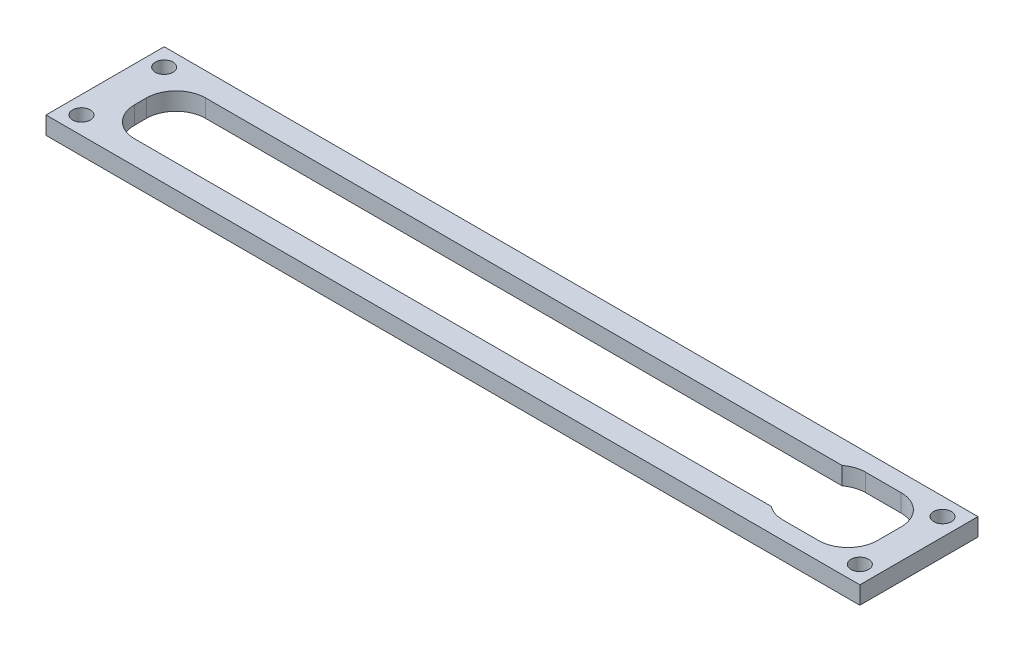
ISO-10303-21;
HEADER;
FILE_DESCRIPTION(('STEP AP214'),'2;1');
FILE_NAME('part.step','',(''),(''),'','','');
FILE_SCHEMA(('AUTOMOTIVE_DESIGN { 1 0 10303 214 1 1 1 1 }'));
ENDSEC;
DATA;
#1=APPLICATION_CONTEXT('core data for automotive mechanical design processes');
#2=APPLICATION_PROTOCOL_DEFINITION('international standard','automotive_design',2000,#1);
#3=PRODUCT_CONTEXT('',#1,'mechanical');
#4=PRODUCT('Part','Part','',(#3));
#5=PRODUCT_RELATED_PRODUCT_CATEGORY('part','',(#4));
#6=PRODUCT_DEFINITION_FORMATION('','',#4);
#7=PRODUCT_DEFINITION_CONTEXT('part definition',#1,'design');
#8=PRODUCT_DEFINITION('design','',#6,#7);
#9=PRODUCT_DEFINITION_SHAPE('','',#8);
#10=(LENGTH_UNIT() NAMED_UNIT(*) SI_UNIT(.MILLI.,.METRE.));
#11=(NAMED_UNIT(*) PLANE_ANGLE_UNIT() SI_UNIT($,.RADIAN.));
#12=(NAMED_UNIT(*) SI_UNIT($,.STERADIAN.) SOLID_ANGLE_UNIT());
#13=UNCERTAINTY_MEASURE_WITH_UNIT(LENGTH_MEASURE(1.E-05),#10,'distance_accuracy_value','');
#14=(GEOMETRIC_REPRESENTATION_CONTEXT(3) GLOBAL_UNCERTAINTY_ASSIGNED_CONTEXT((#13)) GLOBAL_UNIT_ASSIGNED_CONTEXT((#10,
#11,#12)) REPRESENTATION_CONTEXT('',''));
#15=CARTESIAN_POINT('',(0.,0.,0.));
#16=DIRECTION('',(0.,0.,1.));
#17=DIRECTION('',(1.,0.,0.));
#18=AXIS2_PLACEMENT_3D('',#15,#16,#17);
#19=CARTESIAN_POINT('',(0.,3.,0.));
#20=DIRECTION('',(0.,-1.,0.));
#21=DIRECTION('',(0.,0.,-1.));
#22=AXIS2_PLACEMENT_3D('',#19,#20,#21);
#23=PLANE('',#22);
#24=DIRECTION('',(0.,0.,1.));
#25=VECTOR('',#24,1.);
#26=CARTESIAN_POINT('',(0.,3.,0.));
#27=LINE('',#26,#25);
#28=CARTESIAN_POINT('',(0.,3.,-20.));
#29=VERTEX_POINT('',#28);
#30=CARTESIAN_POINT('',(0.,3.,0.));
#31=VERTEX_POINT('',#30);
#32=EDGE_CURVE('E250',#29,#31,#27,.T.);
#33=ORIENTED_EDGE('',*,*,#32,.T.);
#34=DIRECTION('',(1.,0.,0.));
#35=VECTOR('',#34,1.);
#36=CARTESIAN_POINT('',(0.,3.,0.));
#37=LINE('',#36,#35);
#38=CARTESIAN_POINT('',(137.727780531203,3.,0.));
#39=VERTEX_POINT('',#38);
#40=EDGE_CURVE('E253',#31,#39,#37,.T.);
#41=ORIENTED_EDGE('',*,*,#40,.T.);
#42=DIRECTION('',(0.,0.,-1.));
#43=VECTOR('',#42,1.);
#44=CARTESIAN_POINT('',(137.727780531203,3.,0.));
#45=LINE('',#44,#43);
#46=CARTESIAN_POINT('',(137.727780531203,3.,-20.));
#47=VERTEX_POINT('',#46);
#48=EDGE_CURVE('E256',#39,#47,#45,.T.);
#49=ORIENTED_EDGE('',*,*,#48,.T.);
#50=DIRECTION('',(-1.,0.,0.));
#51=VECTOR('',#50,1.);
#52=CARTESIAN_POINT('',(0.,3.,-20.));
#53=LINE('',#52,#51);
#54=EDGE_CURVE('E258',#47,#29,#53,.T.);
#55=ORIENTED_EDGE('',*,*,#54,.T.);
#56=EDGE_LOOP('',(#33,#41,#49,#55));
#57=FACE_BOUND('',#56,.T.);
#58=DIRECTION('',(-1.,0.,0.));
#59=VECTOR('',#58,1.);
#60=CARTESIAN_POINT('',(5.99999999999999,3.,-16.));
#61=LINE('',#60,#59);
#62=CARTESIAN_POINT('',(118.727780531203,3.,-16.));
#63=VERTEX_POINT('',#62);
#64=CARTESIAN_POINT('',(11.,3.,-16.));
#65=VERTEX_POINT('',#64);
#66=EDGE_CURVE('E243',#63,#65,#61,.T.);
#67=ORIENTED_EDGE('',*,*,#66,.F.);
#68=CARTESIAN_POINT('',(121.727780531203,3.,-12.));
#69=DIRECTION('',(0.,-1.,0.));
#70=DIRECTION('',(0.,0.,-1.));
#71=AXIS2_PLACEMENT_3D('',#68,#69,#70);
#72=CIRCLE('',#71,5.);
#73=CARTESIAN_POINT('',(121.727780531203,3.,-17.));
#74=VERTEX_POINT('',#73);
#75=EDGE_CURVE('E193',#63,#74,#72,.T.);
#76=ORIENTED_EDGE('',*,*,#75,.T.);
#77=DIRECTION('',(-1.,0.,0.));
#78=VECTOR('',#77,1.);
#79=CARTESIAN_POINT('',(118.727780531203,3.,-17.));
#80=LINE('',#79,#78);
#81=CARTESIAN_POINT('',(127.727780531203,3.,-17.));
#82=VERTEX_POINT('',#81);
#83=EDGE_CURVE('E205',#82,#74,#80,.T.);
#84=ORIENTED_EDGE('',*,*,#83,.F.);
#85=CARTESIAN_POINT('',(127.727780531203,3.,-12.));
#86=DIRECTION('',(0.,-1.,0.));
#87=DIRECTION('',(0.,0.,-1.));
#88=AXIS2_PLACEMENT_3D('',#85,#86,#87);
#89=CIRCLE('',#88,5.);
#90=CARTESIAN_POINT('',(132.727780531203,3.,-12.));
#91=VERTEX_POINT('',#90);
#92=EDGE_CURVE('E185',#82,#91,#89,.T.);
#93=ORIENTED_EDGE('',*,*,#92,.T.);
#94=DIRECTION('',(0.,0.,-1.));
#95=VECTOR('',#94,1.);
#96=CARTESIAN_POINT('',(132.727780531203,3.,-17.));
#97=LINE('',#96,#95);
#98=CARTESIAN_POINT('',(132.727780531203,3.,-8.00000000000002));
#99=VERTEX_POINT('',#98);
#100=EDGE_CURVE('E202',#99,#91,#97,.T.);
#101=ORIENTED_EDGE('',*,*,#100,.F.);
#102=CARTESIAN_POINT('',(127.727780531203,3.,-8.00000000000002));
#103=DIRECTION('',(0.,-1.,0.));
#104=DIRECTION('',(0.,0.,-1.));
#105=AXIS2_PLACEMENT_3D('',#102,#103,#104);
#106=CIRCLE('',#105,5.);
#107=CARTESIAN_POINT('',(127.727780531203,3.,-3.00000000000002));
#108=VERTEX_POINT('',#107);
#109=EDGE_CURVE('E189',#99,#108,#106,.T.);
#110=ORIENTED_EDGE('',*,*,#109,.T.);
#111=DIRECTION('',(1.,0.,0.));
#112=VECTOR('',#111,1.);
#113=CARTESIAN_POINT('',(118.727780531203,3.,-3.00000000000002));
#114=LINE('',#113,#112);
#115=CARTESIAN_POINT('',(121.727780531203,3.,-3.00000000000002));
#116=VERTEX_POINT('',#115);
#117=EDGE_CURVE('E200',#116,#108,#114,.T.);
#118=ORIENTED_EDGE('',*,*,#117,.F.);
#119=CARTESIAN_POINT('',(121.727780531203,3.,-8.00000000000002));
#120=DIRECTION('',(0.,-1.,0.));
#121=DIRECTION('',(0.,0.,-1.));
#122=AXIS2_PLACEMENT_3D('',#119,#120,#121);
#123=CIRCLE('',#122,5.);
#124=CARTESIAN_POINT('',(118.727780531203,3.,-4.00000000000002));
#125=VERTEX_POINT('',#124);
#126=EDGE_CURVE('E43',#116,#125,#123,.T.);
#127=ORIENTED_EDGE('',*,*,#126,.T.);
#128=DIRECTION('',(1.,0.,0.));
#129=VECTOR('',#128,1.);
#130=CARTESIAN_POINT('',(5.99999999999999,3.,-4.00000000000002));
#131=LINE('',#130,#129);
#132=CARTESIAN_POINT('',(11.,3.,-4.00000000000002));
#133=VERTEX_POINT('',#132);
#134=EDGE_CURVE('E162',#133,#125,#131,.T.);
#135=ORIENTED_EDGE('',*,*,#134,.F.);
#136=CARTESIAN_POINT('',(11.,3.,-9.00000000000001));
#137=DIRECTION('',(0.,-1.,0.));
#138=DIRECTION('',(0.,0.,-1.));
#139=AXIS2_PLACEMENT_3D('',#136,#137,#138);
#140=CIRCLE('',#139,5.);
#141=CARTESIAN_POINT('',(5.99999999999999,3.,-9.00000000000001));
#142=VERTEX_POINT('',#141);
#143=EDGE_CURVE('E179',#133,#142,#140,.T.);
#144=ORIENTED_EDGE('',*,*,#143,.T.);
#145=DIRECTION('',(0.,0.,1.));
#146=VECTOR('',#145,1.);
#147=CARTESIAN_POINT('',(5.99999999999999,3.,-16.));
#148=LINE('',#147,#146);
#149=CARTESIAN_POINT('',(5.99999999999999,3.,-11.));
#150=VERTEX_POINT('',#149);
#151=EDGE_CURVE('E239',#150,#142,#148,.T.);
#152=ORIENTED_EDGE('',*,*,#151,.F.);
#153=CARTESIAN_POINT('',(11.,3.,-11.));
#154=DIRECTION('',(0.,-1.,0.));
#155=DIRECTION('',(0.,0.,-1.));
#156=AXIS2_PLACEMENT_3D('',#153,#154,#155);
#157=CIRCLE('',#156,5.);
#158=EDGE_CURVE('E183',#150,#65,#157,.T.);
#159=ORIENTED_EDGE('',*,*,#158,.T.);
#160=EDGE_LOOP('',(#67,#76,#84,#93,#101,#110,#118,#127,#135,#144,#152,#159));
#161=FACE_BOUND('',#160,.T.);
#162=CARTESIAN_POINT('',(3.,3.,-17.));
#163=DIRECTION('',(0.,1.,0.));
#164=DIRECTION('',(0.,0.,1.));
#165=AXIS2_PLACEMENT_3D('',#162,#163,#164);
#166=CIRCLE('',#165,1.5);
#167=CARTESIAN_POINT('',(3.,3.,-15.5));
#168=VERTEX_POINT('',#167);
#169=EDGE_CURVE('E234',#168,#168,#166,.T.);
#170=ORIENTED_EDGE('',*,*,#169,.F.);
#171=EDGE_LOOP('',(#170));
#172=FACE_BOUND('',#171,.T.);
#173=CARTESIAN_POINT('',(3.,3.,-3.));
#174=DIRECTION('',(0.,1.,0.));
#175=DIRECTION('',(0.,0.,-1.));
#176=AXIS2_PLACEMENT_3D('',#173,#174,#175);
#177=CIRCLE('',#176,1.5);
#178=CARTESIAN_POINT('',(3.,3.,-4.5));
#179=VERTEX_POINT('',#178);
#180=EDGE_CURVE('E228',#179,#179,#177,.T.);
#181=ORIENTED_EDGE('',*,*,#180,.F.);
#182=EDGE_LOOP('',(#181));
#183=FACE_BOUND('',#182,.T.);
#184=CARTESIAN_POINT('',(134.727780531203,3.,-3.00000000000002));
#185=DIRECTION('',(0.,1.,0.));
#186=DIRECTION('',(0.,0.,1.));
#187=AXIS2_PLACEMENT_3D('',#184,#185,#186);
#188=CIRCLE('',#187,1.5);
#189=CARTESIAN_POINT('',(134.727780531203,3.,-1.50000000000002));
#190=VERTEX_POINT('',#189);
#191=EDGE_CURVE('E222',#190,#190,#188,.T.);
#192=ORIENTED_EDGE('',*,*,#191,.F.);
#193=EDGE_LOOP('',(#192));
#194=FACE_BOUND('',#193,.T.);
#195=CARTESIAN_POINT('',(134.727780531203,3.,-17.0000000000001));
#196=DIRECTION('',(0.,1.,0.));
#197=DIRECTION('',(0.,0.,-1.));
#198=AXIS2_PLACEMENT_3D('',#195,#196,#197);
#199=CIRCLE('',#198,1.5);
#200=CARTESIAN_POINT('',(134.727780531203,3.,-18.5));
#201=VERTEX_POINT('',#200);
#202=EDGE_CURVE('E216',#201,#201,#199,.T.);
#203=ORIENTED_EDGE('',*,*,#202,.F.);
#204=EDGE_LOOP('',(#203));
#205=FACE_BOUND('',#204,.T.);
#206=ADVANCED_FACE('F35',(#57,#161,#172,#183,#194,#205),#23,.F.);
#207=CARTESIAN_POINT('',(0.,0.,0.));
#208=DIRECTION('',(0.,-1.,0.));
#209=DIRECTION('',(0.,0.,-1.));
#210=AXIS2_PLACEMENT_3D('',#207,#208,#209);
#211=PLANE('',#210);
#212=DIRECTION('',(-1.,0.,0.));
#213=VECTOR('',#212,1.);
#214=CARTESIAN_POINT('',(118.727780531203,0.,-17.));
#215=LINE('',#214,#213);
#216=CARTESIAN_POINT('',(127.727780531203,0.,-17.));
#217=VERTEX_POINT('',#216);
#218=CARTESIAN_POINT('',(121.727780531203,0.,-17.));
#219=VERTEX_POINT('',#218);
#220=EDGE_CURVE('E165',#217,#219,#215,.T.);
#221=ORIENTED_EDGE('',*,*,#220,.T.);
#222=CARTESIAN_POINT('',(121.727780531203,0.,-12.));
#223=DIRECTION('',(0.,-1.,0.));
#224=DIRECTION('',(0.,0.,-1.));
#225=AXIS2_PLACEMENT_3D('',#222,#223,#224);
#226=CIRCLE('',#225,5.);
#227=CARTESIAN_POINT('',(118.727780531203,0.,-16.));
#228=VERTEX_POINT('',#227);
#229=EDGE_CURVE('E195',#219,#228,#226,.F.);
#230=ORIENTED_EDGE('',*,*,#229,.T.);
#231=DIRECTION('',(-1.,0.,0.));
#232=VECTOR('',#231,1.);
#233=CARTESIAN_POINT('',(5.99999999999999,0.,-16.));
#234=LINE('',#233,#232);
#235=CARTESIAN_POINT('',(11.,0.,-16.));
#236=VERTEX_POINT('',#235);
#237=EDGE_CURVE('E154',#228,#236,#234,.T.);
#238=ORIENTED_EDGE('',*,*,#237,.T.);
#239=CARTESIAN_POINT('',(11.,0.,-11.));
#240=DIRECTION('',(0.,-1.,0.));
#241=DIRECTION('',(0.,0.,-1.));
#242=AXIS2_PLACEMENT_3D('',#239,#240,#241);
#243=CIRCLE('',#242,5.);
#244=CARTESIAN_POINT('',(5.99999999999999,0.,-11.));
#245=VERTEX_POINT('',#244);
#246=EDGE_CURVE('E181',#236,#245,#243,.F.);
#247=ORIENTED_EDGE('',*,*,#246,.T.);
#248=DIRECTION('',(0.,0.,1.));
#249=VECTOR('',#248,1.);
#250=CARTESIAN_POINT('',(5.99999999999999,0.,-16.));
#251=LINE('',#250,#249);
#252=CARTESIAN_POINT('',(5.99999999999999,0.,-9.00000000000001));
#253=VERTEX_POINT('',#252);
#254=EDGE_CURVE('E155',#245,#253,#251,.T.);
#255=ORIENTED_EDGE('',*,*,#254,.T.);
#256=CARTESIAN_POINT('',(11.,0.,-9.00000000000001));
#257=DIRECTION('',(0.,-1.,0.));
#258=DIRECTION('',(0.,0.,-1.));
#259=AXIS2_PLACEMENT_3D('',#256,#257,#258);
#260=CIRCLE('',#259,5.);
#261=CARTESIAN_POINT('',(11.,0.,-4.00000000000002));
#262=VERTEX_POINT('',#261);
#263=EDGE_CURVE('E151',#253,#262,#260,.F.);
#264=ORIENTED_EDGE('',*,*,#263,.T.);
#265=DIRECTION('',(1.,0.,0.));
#266=VECTOR('',#265,1.);
#267=CARTESIAN_POINT('',(5.99999999999999,0.,-4.00000000000002));
#268=LINE('',#267,#266);
#269=CARTESIAN_POINT('',(118.727780531203,0.,-4.00000000000002));
#270=VERTEX_POINT('',#269);
#271=EDGE_CURVE('E145',#262,#270,#268,.T.);
#272=ORIENTED_EDGE('',*,*,#271,.T.);
#273=CARTESIAN_POINT('',(121.727780531203,0.,-8.00000000000002));
#274=DIRECTION('',(0.,-1.,0.));
#275=DIRECTION('',(0.,0.,-1.));
#276=AXIS2_PLACEMENT_3D('',#273,#274,#275);
#277=CIRCLE('',#276,5.);
#278=CARTESIAN_POINT('',(121.727780531203,0.,-3.00000000000002));
#279=VERTEX_POINT('',#278);
#280=EDGE_CURVE('E11',#270,#279,#277,.F.);
#281=ORIENTED_EDGE('',*,*,#280,.T.);
#282=DIRECTION('',(1.,0.,0.));
#283=VECTOR('',#282,1.);
#284=CARTESIAN_POINT('',(118.727780531203,0.,-3.00000000000002));
#285=LINE('',#284,#283);
#286=CARTESIAN_POINT('',(127.727780531203,0.,-3.00000000000002));
#287=VERTEX_POINT('',#286);
#288=EDGE_CURVE('E212',#279,#287,#285,.T.);
#289=ORIENTED_EDGE('',*,*,#288,.T.);
#290=CARTESIAN_POINT('',(127.727780531203,0.,-8.00000000000002));
#291=DIRECTION('',(0.,-1.,0.));
#292=DIRECTION('',(0.,0.,-1.));
#293=AXIS2_PLACEMENT_3D('',#290,#291,#292);
#294=CIRCLE('',#293,5.);
#295=CARTESIAN_POINT('',(132.727780531203,0.,-8.00000000000002));
#296=VERTEX_POINT('',#295);
#297=EDGE_CURVE('E191',#287,#296,#294,.F.);
#298=ORIENTED_EDGE('',*,*,#297,.T.);
#299=DIRECTION('',(0.,0.,-1.));
#300=VECTOR('',#299,1.);
#301=CARTESIAN_POINT('',(132.727780531203,0.,-17.));
#302=LINE('',#301,#300);
#303=CARTESIAN_POINT('',(132.727780531203,0.,-12.));
#304=VERTEX_POINT('',#303);
#305=EDGE_CURVE('E300',#296,#304,#302,.T.);
#306=ORIENTED_EDGE('',*,*,#305,.T.);
#307=CARTESIAN_POINT('',(127.727780531203,0.,-12.));
#308=DIRECTION('',(0.,-1.,0.));
#309=DIRECTION('',(0.,0.,-1.));
#310=AXIS2_PLACEMENT_3D('',#307,#308,#309);
#311=CIRCLE('',#310,5.);
#312=EDGE_CURVE('E187',#304,#217,#311,.F.);
#313=ORIENTED_EDGE('',*,*,#312,.T.);
#314=EDGE_LOOP('',(#221,#230,#238,#247,#255,#264,#272,#281,#289,#298,#306,#313));
#315=FACE_BOUND('',#314,.T.);
#316=CARTESIAN_POINT('',(134.727780531203,0.,-3.00000000000002));
#317=DIRECTION('',(0.,1.,0.));
#318=DIRECTION('',(0.,0.,1.));
#319=AXIS2_PLACEMENT_3D('',#316,#317,#318);
#320=CIRCLE('',#319,1.5);
#321=CARTESIAN_POINT('',(134.727780531203,0.,-1.50000000000002));
#322=VERTEX_POINT('',#321);
#323=EDGE_CURVE('E219',#322,#322,#320,.T.);
#324=ORIENTED_EDGE('',*,*,#323,.T.);
#325=EDGE_LOOP('',(#324));
#326=FACE_BOUND('',#325,.T.);
#327=CARTESIAN_POINT('',(3.,0.,-17.));
#328=DIRECTION('',(0.,1.,0.));
#329=DIRECTION('',(0.,0.,1.));
#330=AXIS2_PLACEMENT_3D('',#327,#328,#329);
#331=CIRCLE('',#330,1.5);
#332=CARTESIAN_POINT('',(3.,0.,-15.5));
#333=VERTEX_POINT('',#332);
#334=EDGE_CURVE('E231',#333,#333,#331,.T.);
#335=ORIENTED_EDGE('',*,*,#334,.T.);
#336=EDGE_LOOP('',(#335));
#337=FACE_BOUND('',#336,.T.);
#338=DIRECTION('',(0.,0.,1.));
#339=VECTOR('',#338,1.);
#340=CARTESIAN_POINT('',(0.,0.,0.));
#341=LINE('',#340,#339);
#342=CARTESIAN_POINT('',(0.,0.,-20.));
#343=VERTEX_POINT('',#342);
#344=CARTESIAN_POINT('',(0.,0.,0.));
#345=VERTEX_POINT('',#344);
#346=EDGE_CURVE('E246',#343,#345,#341,.T.);
#347=ORIENTED_EDGE('',*,*,#346,.F.);
#348=DIRECTION('',(-1.,0.,0.));
#349=VECTOR('',#348,1.);
#350=CARTESIAN_POINT('',(0.,0.,-20.));
#351=LINE('',#350,#349);
#352=CARTESIAN_POINT('',(137.727780531203,0.,-20.));
#353=VERTEX_POINT('',#352);
#354=EDGE_CURVE('E254',#353,#343,#351,.T.);
#355=ORIENTED_EDGE('',*,*,#354,.F.);
#356=DIRECTION('',(0.,0.,-1.));
#357=VECTOR('',#356,1.);
#358=CARTESIAN_POINT('',(137.727780531203,0.,0.));
#359=LINE('',#358,#357);
#360=CARTESIAN_POINT('',(137.727780531203,0.,0.));
#361=VERTEX_POINT('',#360);
#362=EDGE_CURVE('E265',#361,#353,#359,.T.);
#363=ORIENTED_EDGE('',*,*,#362,.F.);
#364=DIRECTION('',(1.,0.,0.));
#365=VECTOR('',#364,1.);
#366=CARTESIAN_POINT('',(0.,0.,0.));
#367=LINE('',#366,#365);
#368=EDGE_CURVE('E263',#345,#361,#367,.T.);
#369=ORIENTED_EDGE('',*,*,#368,.F.);
#370=EDGE_LOOP('',(#347,#355,#363,#369));
#371=FACE_BOUND('',#370,.T.);
#372=CARTESIAN_POINT('',(3.,0.,-3.));
#373=DIRECTION('',(0.,1.,0.));
#374=DIRECTION('',(0.,0.,-1.));
#375=AXIS2_PLACEMENT_3D('',#372,#373,#374);
#376=CIRCLE('',#375,1.5);
#377=CARTESIAN_POINT('',(3.,0.,-4.5));
#378=VERTEX_POINT('',#377);
#379=EDGE_CURVE('E225',#378,#378,#376,.T.);
#380=ORIENTED_EDGE('',*,*,#379,.T.);
#381=EDGE_LOOP('',(#380));
#382=FACE_BOUND('',#381,.T.);
#383=CARTESIAN_POINT('',(134.727780531203,0.,-17.0000000000001));
#384=DIRECTION('',(0.,1.,0.));
#385=DIRECTION('',(0.,0.,-1.));
#386=AXIS2_PLACEMENT_3D('',#383,#384,#385);
#387=CIRCLE('',#386,1.5);
#388=CARTESIAN_POINT('',(134.727780531203,0.,-18.5));
#389=VERTEX_POINT('',#388);
#390=EDGE_CURVE('E214',#389,#389,#387,.T.);
#391=ORIENTED_EDGE('',*,*,#390,.T.);
#392=EDGE_LOOP('',(#391));
#393=FACE_BOUND('',#392,.T.);
#394=ADVANCED_FACE('F148',(#315,#326,#337,#371,#382,#393),#211,.T.);
#395=CARTESIAN_POINT('',(0.,3.,0.));
#396=DIRECTION('',(1.,0.,0.));
#397=DIRECTION('',(0.,0.,-1.));
#398=AXIS2_PLACEMENT_3D('',#395,#396,#397);
#399=PLANE('',#398);
#400=ORIENTED_EDGE('',*,*,#346,.T.);
#401=DIRECTION('',(0.,-1.,0.));
#402=VECTOR('',#401,1.);
#403=CARTESIAN_POINT('',(0.,3.,0.));
#404=LINE('',#403,#402);
#405=EDGE_CURVE('E276',#31,#345,#404,.T.);
#406=ORIENTED_EDGE('',*,*,#405,.F.);
#407=ORIENTED_EDGE('',*,*,#32,.F.);
#408=DIRECTION('',(0.,-1.,0.));
#409=VECTOR('',#408,1.);
#410=CARTESIAN_POINT('',(0.,3.,-20.));
#411=LINE('',#410,#409);
#412=EDGE_CURVE('E260',#29,#343,#411,.T.);
#413=ORIENTED_EDGE('',*,*,#412,.T.);
#414=EDGE_LOOP('',(#400,#406,#407,#413));
#415=FACE_BOUND('',#414,.T.);
#416=ADVANCED_FACE('F331',(#415),#399,.F.);
#417=CARTESIAN_POINT('',(0.,3.,0.));
#418=DIRECTION('',(0.,0.,-1.));
#419=DIRECTION('',(-1.,0.,0.));
#420=AXIS2_PLACEMENT_3D('',#417,#418,#419);
#421=PLANE('',#420);
#422=ORIENTED_EDGE('',*,*,#368,.T.);
#423=DIRECTION('',(0.,-1.,0.));
#424=VECTOR('',#423,1.);
#425=CARTESIAN_POINT('',(137.727780531203,3.,0.));
#426=LINE('',#425,#424);
#427=EDGE_CURVE('E273',#39,#361,#426,.T.);
#428=ORIENTED_EDGE('',*,*,#427,.F.);
#429=ORIENTED_EDGE('',*,*,#40,.F.);
#430=ORIENTED_EDGE('',*,*,#405,.T.);
#431=EDGE_LOOP('',(#422,#428,#429,#430));
#432=FACE_BOUND('',#431,.T.);
#433=ADVANCED_FACE('F344',(#432),#421,.F.);
#434=CARTESIAN_POINT('',(137.727780531203,3.,0.));
#435=DIRECTION('',(-1.,0.,0.));
#436=DIRECTION('',(0.,0.,1.));
#437=AXIS2_PLACEMENT_3D('',#434,#435,#436);
#438=PLANE('',#437);
#439=ORIENTED_EDGE('',*,*,#362,.T.);
#440=DIRECTION('',(0.,-1.,0.));
#441=VECTOR('',#440,1.);
#442=CARTESIAN_POINT('',(137.727780531203,3.,-20.));
#443=LINE('',#442,#441);
#444=EDGE_CURVE('E270',#47,#353,#443,.T.);
#445=ORIENTED_EDGE('',*,*,#444,.F.);
#446=ORIENTED_EDGE('',*,*,#48,.F.);
#447=ORIENTED_EDGE('',*,*,#427,.T.);
#448=EDGE_LOOP('',(#439,#445,#446,#447));
#449=FACE_BOUND('',#448,.T.);
#450=ADVANCED_FACE('F340',(#449),#438,.F.);
#451=CARTESIAN_POINT('',(0.,3.,-20.));
#452=DIRECTION('',(0.,0.,1.));
#453=DIRECTION('',(1.,0.,0.));
#454=AXIS2_PLACEMENT_3D('',#451,#452,#453);
#455=PLANE('',#454);
#456=ORIENTED_EDGE('',*,*,#354,.T.);
#457=ORIENTED_EDGE('',*,*,#412,.F.);
#458=ORIENTED_EDGE('',*,*,#54,.F.);
#459=ORIENTED_EDGE('',*,*,#444,.T.);
#460=EDGE_LOOP('',(#456,#457,#458,#459));
#461=FACE_BOUND('',#460,.T.);
#462=ADVANCED_FACE('F337',(#461),#455,.F.);
#463=CARTESIAN_POINT('',(5.99999999999999,3.,-16.));
#464=DIRECTION('',(1.,0.,0.));
#465=DIRECTION('',(0.,0.,-1.));
#466=AXIS2_PLACEMENT_3D('',#463,#464,#465);
#467=PLANE('',#466);
#468=ORIENTED_EDGE('',*,*,#151,.T.);
#469=DIRECTION('',(0.,-1.,0.));
#470=VECTOR('',#469,1.);
#471=CARTESIAN_POINT('',(5.99999999999999,0.,-9.00000000000001));
#472=LINE('',#471,#470);
#473=EDGE_CURVE('E281',#142,#253,#472,.T.);
#474=ORIENTED_EDGE('',*,*,#473,.T.);
#475=ORIENTED_EDGE('',*,*,#254,.F.);
#476=DIRECTION('',(0.,-1.,0.));
#477=VECTOR('',#476,1.);
#478=CARTESIAN_POINT('',(5.99999999999999,3.,-11.));
#479=LINE('',#478,#477);
#480=EDGE_CURVE('E279',#245,#150,#479,.F.);
#481=ORIENTED_EDGE('',*,*,#480,.T.);
#482=EDGE_LOOP('',(#468,#474,#475,#481));
#483=FACE_BOUND('',#482,.T.);
#484=ADVANCED_FACE('F334',(#483),#467,.T.);
#485=CARTESIAN_POINT('',(5.99999999999999,3.,-4.00000000000002));
#486=DIRECTION('',(0.,0.,-1.));
#487=DIRECTION('',(-1.,0.,0.));
#488=AXIS2_PLACEMENT_3D('',#485,#486,#487);
#489=PLANE('',#488);
#490=ORIENTED_EDGE('',*,*,#271,.F.);
#491=DIRECTION('',(0.,-1.,0.));
#492=VECTOR('',#491,1.);
#493=CARTESIAN_POINT('',(11.,3.,-4.00000000000002));
#494=LINE('',#493,#492);
#495=EDGE_CURVE('E284',#262,#133,#494,.F.);
#496=ORIENTED_EDGE('',*,*,#495,.T.);
#497=ORIENTED_EDGE('',*,*,#134,.T.);
#498=DIRECTION('',(0.,1.,0.));
#499=VECTOR('',#498,1.);
#500=CARTESIAN_POINT('',(118.727780531203,0.,-4.00000000000002));
#501=LINE('',#500,#499);
#502=EDGE_CURVE('E159',#270,#125,#501,.T.);
#503=ORIENTED_EDGE('',*,*,#502,.F.);
#504=EDGE_LOOP('',(#490,#496,#497,#503));
#505=FACE_BOUND('',#504,.T.);
#506=ADVANCED_FACE('F160',(#505),#489,.T.);
#507=CARTESIAN_POINT('',(5.99999999999999,3.,-16.));
#508=DIRECTION('',(0.,0.,1.));
#509=DIRECTION('',(1.,0.,0.));
#510=AXIS2_PLACEMENT_3D('',#507,#508,#509);
#511=PLANE('',#510);
#512=ORIENTED_EDGE('',*,*,#66,.T.);
#513=DIRECTION('',(0.,-1.,0.));
#514=VECTOR('',#513,1.);
#515=CARTESIAN_POINT('',(11.,0.,-16.));
#516=LINE('',#515,#514);
#517=EDGE_CURVE('E286',#65,#236,#516,.T.);
#518=ORIENTED_EDGE('',*,*,#517,.T.);
#519=ORIENTED_EDGE('',*,*,#237,.F.);
#520=DIRECTION('',(0.,1.,0.));
#521=VECTOR('',#520,1.);
#522=CARTESIAN_POINT('',(118.727780531203,0.,-16.));
#523=LINE('',#522,#521);
#524=EDGE_CURVE('E164',#228,#63,#523,.T.);
#525=ORIENTED_EDGE('',*,*,#524,.T.);
#526=EDGE_LOOP('',(#512,#518,#519,#525));
#527=FACE_BOUND('',#526,.T.);
#528=ADVANCED_FACE('F366',(#527),#511,.T.);
#529=CARTESIAN_POINT('',(3.,3.,-17.));
#530=DIRECTION('',(0.,-1.,0.));
#531=DIRECTION('',(0.,0.,-1.));
#532=AXIS2_PLACEMENT_3D('',#529,#530,#531);
#533=CYLINDRICAL_SURFACE('',#532,1.5);
#534=ORIENTED_EDGE('',*,*,#169,.T.);
#535=EDGE_LOOP('',(#534));
#536=FACE_BOUND('',#535,.T.);
#537=ORIENTED_EDGE('',*,*,#334,.F.);
#538=EDGE_LOOP('',(#537));
#539=FACE_BOUND('',#538,.T.);
#540=ADVANCED_FACE('F379',(#536,#539),#533,.F.);
#541=CARTESIAN_POINT('',(3.,3.,-3.));
#542=DIRECTION('',(0.,-1.,0.));
#543=DIRECTION('',(0.,0.,-1.));
#544=AXIS2_PLACEMENT_3D('',#541,#542,#543);
#545=CYLINDRICAL_SURFACE('',#544,1.5);
#546=ORIENTED_EDGE('',*,*,#180,.T.);
#547=EDGE_LOOP('',(#546));
#548=FACE_BOUND('',#547,.T.);
#549=ORIENTED_EDGE('',*,*,#379,.F.);
#550=EDGE_LOOP('',(#549));
#551=FACE_BOUND('',#550,.T.);
#552=ADVANCED_FACE('F384',(#548,#551),#545,.F.);
#553=CARTESIAN_POINT('',(134.727780531203,3.,-3.00000000000002));
#554=DIRECTION('',(0.,-1.,0.));
#555=DIRECTION('',(0.,0.,-1.));
#556=AXIS2_PLACEMENT_3D('',#553,#554,#555);
#557=CYLINDRICAL_SURFACE('',#556,1.5);
#558=ORIENTED_EDGE('',*,*,#191,.T.);
#559=EDGE_LOOP('',(#558));
#560=FACE_BOUND('',#559,.T.);
#561=ORIENTED_EDGE('',*,*,#323,.F.);
#562=EDGE_LOOP('',(#561));
#563=FACE_BOUND('',#562,.T.);
#564=ADVANCED_FACE('F388',(#560,#563),#557,.F.);
#565=CARTESIAN_POINT('',(134.727780531203,3.,-17.0000000000001));
#566=DIRECTION('',(0.,-1.,0.));
#567=DIRECTION('',(0.,0.,-1.));
#568=AXIS2_PLACEMENT_3D('',#565,#566,#567);
#569=CYLINDRICAL_SURFACE('',#568,1.5);
#570=ORIENTED_EDGE('',*,*,#202,.T.);
#571=EDGE_LOOP('',(#570));
#572=FACE_BOUND('',#571,.T.);
#573=ORIENTED_EDGE('',*,*,#390,.F.);
#574=EDGE_LOOP('',(#573));
#575=FACE_BOUND('',#574,.T.);
#576=ADVANCED_FACE('F392',(#572,#575),#569,.F.);
#577=CARTESIAN_POINT('',(118.727780531203,0.,-17.));
#578=DIRECTION('',(0.,0.,-1.));
#579=DIRECTION('',(-1.,0.,0.));
#580=AXIS2_PLACEMENT_3D('',#577,#578,#579);
#581=PLANE('',#580);
#582=ORIENTED_EDGE('',*,*,#220,.F.);
#583=DIRECTION('',(0.,1.,0.));
#584=VECTOR('',#583,1.);
#585=CARTESIAN_POINT('',(127.727780531203,3.,-17.));
#586=LINE('',#585,#584);
#587=EDGE_CURVE('E291',#217,#82,#586,.T.);
#588=ORIENTED_EDGE('',*,*,#587,.T.);
#589=ORIENTED_EDGE('',*,*,#83,.T.);
#590=DIRECTION('',(0.,1.,0.));
#591=VECTOR('',#590,1.);
#592=CARTESIAN_POINT('',(121.727780531203,0.,-17.));
#593=LINE('',#592,#591);
#594=EDGE_CURVE('E289',#74,#219,#593,.F.);
#595=ORIENTED_EDGE('',*,*,#594,.T.);
#596=EDGE_LOOP('',(#582,#588,#589,#595));
#597=FACE_BOUND('',#596,.T.);
#598=ADVANCED_FACE('F310',(#597),#581,.F.);
#599=CARTESIAN_POINT('',(132.727780531203,0.,-17.));
#600=DIRECTION('',(1.,0.,0.));
#601=DIRECTION('',(0.,0.,-1.));
#602=AXIS2_PLACEMENT_3D('',#599,#600,#601);
#603=PLANE('',#602);
#604=ORIENTED_EDGE('',*,*,#100,.T.);
#605=DIRECTION('',(0.,1.,0.));
#606=VECTOR('',#605,1.);
#607=CARTESIAN_POINT('',(132.727780531203,0.,-12.));
#608=LINE('',#607,#606);
#609=EDGE_CURVE('E171',#91,#304,#608,.F.);
#610=ORIENTED_EDGE('',*,*,#609,.T.);
#611=ORIENTED_EDGE('',*,*,#305,.F.);
#612=DIRECTION('',(0.,1.,0.));
#613=VECTOR('',#612,1.);
#614=CARTESIAN_POINT('',(132.727780531203,3.,-8.00000000000002));
#615=LINE('',#614,#613);
#616=EDGE_CURVE('E174',#296,#99,#615,.T.);
#617=ORIENTED_EDGE('',*,*,#616,.T.);
#618=EDGE_LOOP('',(#604,#610,#611,#617));
#619=FACE_BOUND('',#618,.T.);
#620=ADVANCED_FACE('F297',(#619),#603,.F.);
#621=CARTESIAN_POINT('',(118.727780531203,0.,-3.00000000000002));
#622=DIRECTION('',(0.,0.,1.));
#623=DIRECTION('',(1.,0.,0.));
#624=AXIS2_PLACEMENT_3D('',#621,#622,#623);
#625=PLANE('',#624);
#626=ORIENTED_EDGE('',*,*,#117,.T.);
#627=DIRECTION('',(0.,1.,0.));
#628=VECTOR('',#627,1.);
#629=CARTESIAN_POINT('',(127.727780531203,0.,-3.00000000000003));
#630=LINE('',#629,#628);
#631=EDGE_CURVE('E50',#108,#287,#630,.F.);
#632=ORIENTED_EDGE('',*,*,#631,.T.);
#633=ORIENTED_EDGE('',*,*,#288,.F.);
#634=DIRECTION('',(0.,-1.,0.));
#635=VECTOR('',#634,1.);
#636=CARTESIAN_POINT('',(121.727780531203,0.,-3.00000000000002));
#637=LINE('',#636,#635);
#638=EDGE_CURVE('E169',#279,#116,#637,.F.);
#639=ORIENTED_EDGE('',*,*,#638,.T.);
#640=EDGE_LOOP('',(#626,#632,#633,#639));
#641=FACE_BOUND('',#640,.T.);
#642=ADVANCED_FACE('F355',(#641),#625,.F.);
#643=CARTESIAN_POINT('',(11.,3.,-9.00000000000001));
#644=DIRECTION('',(0.,1.,0.));
#645=DIRECTION('',(0.,0.,1.));
#646=AXIS2_PLACEMENT_3D('',#643,#644,#645);
#647=CYLINDRICAL_SURFACE('',#646,5.);
#648=ORIENTED_EDGE('',*,*,#143,.F.);
#649=ORIENTED_EDGE('',*,*,#495,.F.);
#650=ORIENTED_EDGE('',*,*,#263,.F.);
#651=ORIENTED_EDGE('',*,*,#473,.F.);
#652=EDGE_LOOP('',(#648,#649,#650,#651));
#653=FACE_BOUND('',#652,.T.);
#654=ADVANCED_FACE('F352',(#653),#647,.F.);
#655=CARTESIAN_POINT('',(11.,3.,-11.));
#656=DIRECTION('',(0.,1.,0.));
#657=DIRECTION('',(0.,0.,1.));
#658=AXIS2_PLACEMENT_3D('',#655,#656,#657);
#659=CYLINDRICAL_SURFACE('',#658,5.);
#660=ORIENTED_EDGE('',*,*,#158,.F.);
#661=ORIENTED_EDGE('',*,*,#480,.F.);
#662=ORIENTED_EDGE('',*,*,#246,.F.);
#663=ORIENTED_EDGE('',*,*,#517,.F.);
#664=EDGE_LOOP('',(#660,#661,#662,#663));
#665=FACE_BOUND('',#664,.T.);
#666=ADVANCED_FACE('F323',(#665),#659,.F.);
#667=CARTESIAN_POINT('',(127.727780531203,0.,-12.));
#668=DIRECTION('',(0.,-1.,0.));
#669=DIRECTION('',(0.,0.,-1.));
#670=AXIS2_PLACEMENT_3D('',#667,#668,#669);
#671=CYLINDRICAL_SURFACE('',#670,5.);
#672=ORIENTED_EDGE('',*,*,#312,.F.);
#673=ORIENTED_EDGE('',*,*,#609,.F.);
#674=ORIENTED_EDGE('',*,*,#92,.F.);
#675=ORIENTED_EDGE('',*,*,#587,.F.);
#676=EDGE_LOOP('',(#672,#673,#674,#675));
#677=FACE_BOUND('',#676,.T.);
#678=ADVANCED_FACE('F307',(#677),#671,.F.);
#679=CARTESIAN_POINT('',(127.727780531203,0.,-8.00000000000002));
#680=DIRECTION('',(0.,-1.,0.));
#681=DIRECTION('',(0.,0.,-1.));
#682=AXIS2_PLACEMENT_3D('',#679,#680,#681);
#683=CYLINDRICAL_SURFACE('',#682,5.);
#684=ORIENTED_EDGE('',*,*,#297,.F.);
#685=ORIENTED_EDGE('',*,*,#631,.F.);
#686=ORIENTED_EDGE('',*,*,#109,.F.);
#687=ORIENTED_EDGE('',*,*,#616,.F.);
#688=EDGE_LOOP('',(#684,#685,#686,#687));
#689=FACE_BOUND('',#688,.T.);
#690=ADVANCED_FACE('F314',(#689),#683,.F.);
#691=CARTESIAN_POINT('',(121.727780531203,0.,-12.));
#692=DIRECTION('',(0.,1.,0.));
#693=DIRECTION('',(0.,0.,1.));
#694=AXIS2_PLACEMENT_3D('',#691,#692,#693);
#695=CYLINDRICAL_SURFACE('',#694,5.);
#696=ORIENTED_EDGE('',*,*,#229,.F.);
#697=ORIENTED_EDGE('',*,*,#594,.F.);
#698=ORIENTED_EDGE('',*,*,#75,.F.);
#699=ORIENTED_EDGE('',*,*,#524,.F.);
#700=EDGE_LOOP('',(#696,#697,#698,#699));
#701=FACE_BOUND('',#700,.T.);
#702=ADVANCED_FACE('F316',(#701),#695,.F.);
#703=CARTESIAN_POINT('',(121.727780531203,0.,-8.00000000000002));
#704=DIRECTION('',(0.,-1.,0.));
#705=DIRECTION('',(0.,0.,-1.));
#706=AXIS2_PLACEMENT_3D('',#703,#704,#705);
#707=CYLINDRICAL_SURFACE('',#706,5.);
#708=ORIENTED_EDGE('',*,*,#280,.F.);
#709=ORIENTED_EDGE('',*,*,#502,.T.);
#710=ORIENTED_EDGE('',*,*,#126,.F.);
#711=ORIENTED_EDGE('',*,*,#638,.F.);
#712=EDGE_LOOP('',(#708,#709,#710,#711));
#713=FACE_BOUND('',#712,.T.);
#714=ADVANCED_FACE('F37',(#713),#707,.F.);
#715=CLOSED_SHELL('',(#206,#394,#416,#433,#450,#462,#484,#506,#528,#540,#552,#564,#576,#598,
#620,#642,#654,#666,#678,#690,#702,#714));
#716=MANIFOLD_SOLID_BREP('B2',#715);
#717=ADVANCED_BREP_SHAPE_REPRESENTATION('',(#18,#716),#14);
#718=SHAPE_DEFINITION_REPRESENTATION(#9,#717);
ENDSEC;
END-ISO-10303-21;
